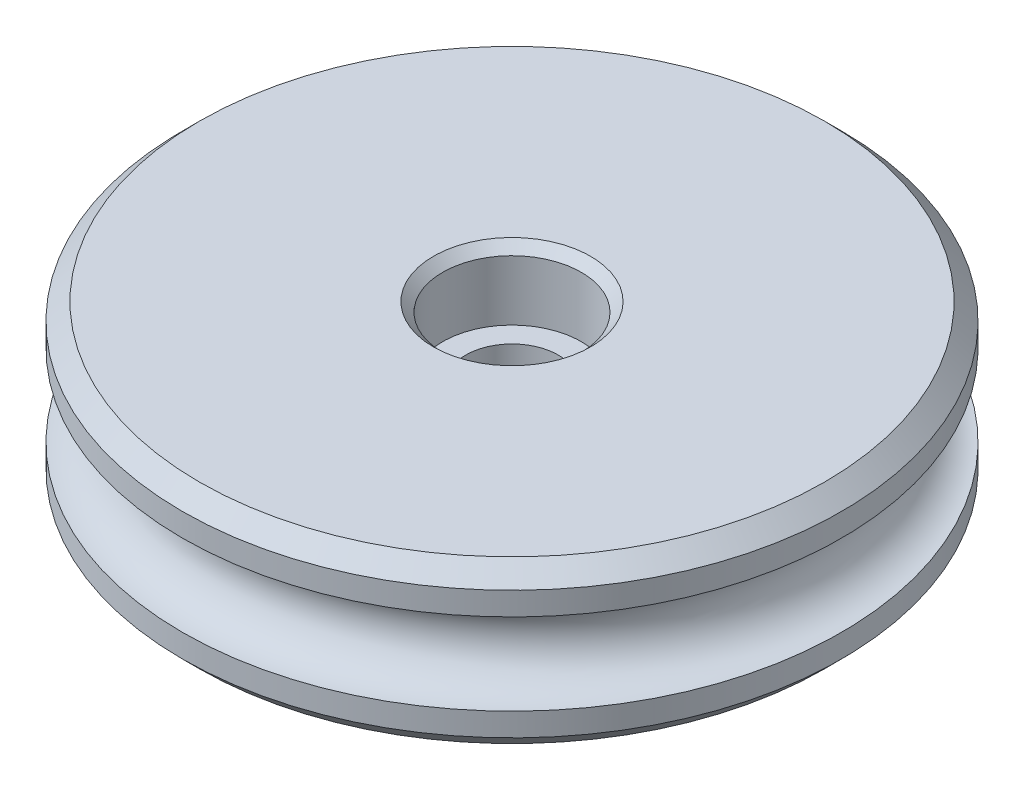
ISO-10303-21;
HEADER;
FILE_DESCRIPTION(('STEP AP214'),'2;1');
FILE_NAME('part.step','',(''),(''),'','','');
FILE_SCHEMA(('AUTOMOTIVE_DESIGN { 1 0 10303 214 1 1 1 1 }'));
ENDSEC;
DATA;
#1=APPLICATION_CONTEXT('core data for automotive mechanical design processes');
#2=APPLICATION_PROTOCOL_DEFINITION('international standard','automotive_design',2000,#1);
#3=PRODUCT_CONTEXT('',#1,'mechanical');
#4=PRODUCT('Part','Part','',(#3));
#5=PRODUCT_RELATED_PRODUCT_CATEGORY('part','',(#4));
#6=PRODUCT_DEFINITION_FORMATION('','',#4);
#7=PRODUCT_DEFINITION_CONTEXT('part definition',#1,'design');
#8=PRODUCT_DEFINITION('design','',#6,#7);
#9=PRODUCT_DEFINITION_SHAPE('','',#8);
#10=(LENGTH_UNIT() NAMED_UNIT(*) SI_UNIT(.MILLI.,.METRE.));
#11=(NAMED_UNIT(*) PLANE_ANGLE_UNIT() SI_UNIT($,.RADIAN.));
#12=(NAMED_UNIT(*) SI_UNIT($,.STERADIAN.) SOLID_ANGLE_UNIT());
#13=UNCERTAINTY_MEASURE_WITH_UNIT(LENGTH_MEASURE(1.E-05),#10,'distance_accuracy_value','');
#14=(GEOMETRIC_REPRESENTATION_CONTEXT(3) GLOBAL_UNCERTAINTY_ASSIGNED_CONTEXT((#13)) GLOBAL_UNIT_ASSIGNED_CONTEXT((#10,
#11,#12)) REPRESENTATION_CONTEXT('',''));
#15=CARTESIAN_POINT('',(0.,0.,0.));
#16=DIRECTION('',(0.,0.,1.));
#17=DIRECTION('',(1.,0.,0.));
#18=AXIS2_PLACEMENT_3D('',#15,#16,#17);
#19=CARTESIAN_POINT('',(0.,19.0174021430808,0.));
#20=DIRECTION('',(0.,1.,0.));
#21=DIRECTION('',(0.,0.,1.));
#22=AXIS2_PLACEMENT_3D('',#19,#20,#21);
#23=CYLINDRICAL_SURFACE('',#22,3.);
#24=CARTESIAN_POINT('',(0.,3.1,0.));
#25=DIRECTION('',(0.,1.,0.));
#26=DIRECTION('',(0.,0.,1.));
#27=AXIS2_PLACEMENT_3D('',#24,#25,#26);
#28=CIRCLE('',#27,3.);
#29=CARTESIAN_POINT('',(0.,3.1,3.));
#30=VERTEX_POINT('',#29);
#31=EDGE_CURVE('E61',#30,#30,#28,.T.);
#32=ORIENTED_EDGE('',*,*,#31,.T.);
#33=EDGE_LOOP('',(#32));
#34=FACE_BOUND('',#33,.T.);
#35=CARTESIAN_POINT('',(0.,0.5,0.));
#36=DIRECTION('',(0.,1.,0.));
#37=DIRECTION('',(0.,0.,1.));
#38=AXIS2_PLACEMENT_3D('',#35,#36,#37);
#39=CIRCLE('',#38,3.);
#40=CARTESIAN_POINT('',(0.,0.5,3.));
#41=VERTEX_POINT('',#40);
#42=EDGE_CURVE('E83',#41,#41,#39,.T.);
#43=ORIENTED_EDGE('',*,*,#42,.F.);
#44=EDGE_LOOP('',(#43));
#45=FACE_BOUND('',#44,.T.);
#46=ADVANCED_FACE('F42',(#34,#45),#23,.F.);
#47=CARTESIAN_POINT('',(0.,3.5,3.));
#48=DIRECTION('',(0.,1.,0.));
#49=DIRECTION('',(0.,0.,1.));
#50=AXIS2_PLACEMENT_3D('',#47,#48,#49);
#51=PLANE('',#50);
#52=CARTESIAN_POINT('',(0.,3.5,0.));
#53=DIRECTION('',(0.,1.,0.));
#54=DIRECTION('',(0.,0.,1.));
#55=AXIS2_PLACEMENT_3D('',#52,#53,#54);
#56=CIRCLE('',#55,3.4);
#57=CARTESIAN_POINT('',(0.,3.5,3.4));
#58=VERTEX_POINT('',#57);
#59=EDGE_CURVE('E56',#58,#58,#56,.F.);
#60=ORIENTED_EDGE('',*,*,#59,.T.);
#61=EDGE_LOOP('',(#60));
#62=FACE_BOUND('',#61,.T.);
#63=CARTESIAN_POINT('',(0.,3.5,0.));
#64=DIRECTION('',(0.,1.,0.));
#65=DIRECTION('',(0.,0.,1.));
#66=AXIS2_PLACEMENT_3D('',#63,#64,#65);
#67=CIRCLE('',#66,13.5274);
#68=CARTESIAN_POINT('',(0.,3.5,13.5274));
#69=VERTEX_POINT('',#68);
#70=EDGE_CURVE('E67',#69,#69,#67,.T.);
#71=ORIENTED_EDGE('',*,*,#70,.T.);
#72=EDGE_LOOP('',(#71));
#73=FACE_BOUND('',#72,.T.);
#74=ADVANCED_FACE('F134',(#62,#73),#51,.T.);
#75=CARTESIAN_POINT('',(0.,3.5,0.));
#76=DIRECTION('',(0.,-1.,0.));
#77=DIRECTION('',(0.,0.,-1.));
#78=AXIS2_PLACEMENT_3D('',#75,#76,#77);
#79=CONICAL_SURFACE('',#78,13.5274,0.785398163397453);
#80=CARTESIAN_POINT('',(0.,2.7653,0.));
#81=DIRECTION('',(0.,1.,0.));
#82=DIRECTION('',(0.,0.,1.));
#83=AXIS2_PLACEMENT_3D('',#80,#81,#82);
#84=CIRCLE('',#83,14.2621);
#85=CARTESIAN_POINT('',(0.,2.7653,14.2621));
#86=VERTEX_POINT('',#85);
#87=EDGE_CURVE('E71',#86,#86,#84,.T.);
#88=ORIENTED_EDGE('',*,*,#87,.T.);
#89=EDGE_LOOP('',(#88));
#90=FACE_BOUND('',#89,.T.);
#91=ORIENTED_EDGE('',*,*,#70,.F.);
#92=EDGE_LOOP('',(#91));
#93=FACE_BOUND('',#92,.T.);
#94=ADVANCED_FACE('F141',(#90,#93),#79,.T.);
#95=CARTESIAN_POINT('',(0.,19.0174021430808,0.));
#96=DIRECTION('',(0.,1.,0.));
#97=DIRECTION('',(0.,0.,1.));
#98=AXIS2_PLACEMENT_3D('',#95,#96,#97);
#99=CYLINDRICAL_SURFACE('',#98,14.2621);
#100=CARTESIAN_POINT('',(0.,1.7653,0.));
#101=DIRECTION('',(0.,1.,0.));
#102=DIRECTION('',(0.,0.,1.));
#103=AXIS2_PLACEMENT_3D('',#100,#101,#102);
#104=CIRCLE('',#103,14.2621);
#105=CARTESIAN_POINT('',(0.,1.7653,14.2621));
#106=VERTEX_POINT('',#105);
#107=EDGE_CURVE('E75',#106,#106,#104,.T.);
#108=ORIENTED_EDGE('',*,*,#107,.T.);
#109=EDGE_LOOP('',(#108));
#110=FACE_BOUND('',#109,.T.);
#111=ORIENTED_EDGE('',*,*,#87,.F.);
#112=EDGE_LOOP('',(#111));
#113=FACE_BOUND('',#112,.T.);
#114=ADVANCED_FACE('F130',(#110,#113),#99,.T.);
#115=CARTESIAN_POINT('',(0.,0.,0.));
#116=DIRECTION('',(0.,1.,0.));
#117=DIRECTION('',(0.,0.,1.));
#118=AXIS2_PLACEMENT_3D('',#115,#116,#117);
#119=TOROIDAL_SURFACE('',#118,14.2621,1.7653);
#120=ORIENTED_EDGE('',*,*,#107,.F.);
#121=EDGE_LOOP('',(#120));
#122=FACE_BOUND('',#121,.T.);
#123=CARTESIAN_POINT('',(0.,-1.7653,0.));
#124=DIRECTION('',(0.,1.,0.));
#125=DIRECTION('',(0.,0.,1.));
#126=AXIS2_PLACEMENT_3D('',#123,#124,#125);
#127=CIRCLE('',#126,14.2621);
#128=CARTESIAN_POINT('',(0.,-1.7653,14.2621));
#129=VERTEX_POINT('',#128);
#130=EDGE_CURVE('E95',#129,#129,#127,.T.);
#131=ORIENTED_EDGE('',*,*,#130,.T.);
#132=EDGE_LOOP('',(#131));
#133=FACE_BOUND('',#132,.T.);
#134=ADVANCED_FACE('F121',(#122,#133),#119,.F.);
#135=CARTESIAN_POINT('',(0.,19.0174021430808,0.));
#136=DIRECTION('',(0.,1.,0.));
#137=DIRECTION('',(0.,0.,1.));
#138=AXIS2_PLACEMENT_3D('',#135,#136,#137);
#139=CYLINDRICAL_SURFACE('',#138,2.);
#140=CARTESIAN_POINT('',(0.,0.5,0.));
#141=DIRECTION('',(0.,1.,0.));
#142=DIRECTION('',(0.,0.,1.));
#143=AXIS2_PLACEMENT_3D('',#140,#141,#142);
#144=CIRCLE('',#143,2.);
#145=CARTESIAN_POINT('',(0.,0.5,2.));
#146=VERTEX_POINT('',#145);
#147=EDGE_CURVE('E79',#146,#146,#144,.T.);
#148=ORIENTED_EDGE('',*,*,#147,.T.);
#149=EDGE_LOOP('',(#148));
#150=FACE_BOUND('',#149,.T.);
#151=CARTESIAN_POINT('',(0.,-0.5,0.));
#152=DIRECTION('',(0.,1.,0.));
#153=DIRECTION('',(0.,0.,1.));
#154=AXIS2_PLACEMENT_3D('',#151,#152,#153);
#155=CIRCLE('',#154,2.);
#156=CARTESIAN_POINT('',(0.,-0.5,2.));
#157=VERTEX_POINT('',#156);
#158=EDGE_CURVE('E99',#157,#157,#155,.T.);
#159=ORIENTED_EDGE('',*,*,#158,.F.);
#160=EDGE_LOOP('',(#159));
#161=FACE_BOUND('',#160,.T.);
#162=ADVANCED_FACE('F118',(#150,#161),#139,.F.);
#163=CARTESIAN_POINT('',(0.,0.499999999999999,2.));
#164=DIRECTION('',(0.,1.,0.));
#165=DIRECTION('',(0.,0.,1.));
#166=AXIS2_PLACEMENT_3D('',#163,#164,#165);
#167=PLANE('',#166);
#168=ORIENTED_EDGE('',*,*,#42,.T.);
#169=EDGE_LOOP('',(#168));
#170=FACE_BOUND('',#169,.T.);
#171=ORIENTED_EDGE('',*,*,#147,.F.);
#172=EDGE_LOOP('',(#171));
#173=FACE_BOUND('',#172,.T.);
#174=ADVANCED_FACE('F120',(#170,#173),#167,.T.);
#175=CARTESIAN_POINT('',(0.,-19.0174021430808,0.));
#176=DIRECTION('',(0.,-1.,0.));
#177=DIRECTION('',(0.,0.,1.));
#178=AXIS2_PLACEMENT_3D('',#175,#176,#177);
#179=CYLINDRICAL_SURFACE('',#178,3.);
#180=CARTESIAN_POINT('',(0.,-3.1,0.));
#181=DIRECTION('',(0.,-1.,0.));
#182=DIRECTION('',(0.,0.,-1.));
#183=AXIS2_PLACEMENT_3D('',#180,#181,#182);
#184=CIRCLE('',#183,3.);
#185=CARTESIAN_POINT('',(0.,-3.1,-3.));
#186=VERTEX_POINT('',#185);
#187=EDGE_CURVE('E10',#186,#186,#184,.T.);
#188=ORIENTED_EDGE('',*,*,#187,.T.);
#189=EDGE_LOOP('',(#188));
#190=FACE_BOUND('',#189,.T.);
#191=CARTESIAN_POINT('',(0.,-0.5,0.));
#192=DIRECTION('',(0.,1.,0.));
#193=DIRECTION('',(0.,0.,1.));
#194=AXIS2_PLACEMENT_3D('',#191,#192,#193);
#195=CIRCLE('',#194,3.);
#196=CARTESIAN_POINT('',(0.,-0.5,3.));
#197=VERTEX_POINT('',#196);
#198=EDGE_CURVE('E103',#197,#197,#195,.T.);
#199=ORIENTED_EDGE('',*,*,#198,.T.);
#200=EDGE_LOOP('',(#199));
#201=FACE_BOUND('',#200,.T.);
#202=ADVANCED_FACE('F108',(#190,#201),#179,.F.);
#203=CARTESIAN_POINT('',(0.,-3.5,3.));
#204=DIRECTION('',(0.,-1.,0.));
#205=DIRECTION('',(0.,0.,1.));
#206=AXIS2_PLACEMENT_3D('',#203,#204,#205);
#207=PLANE('',#206);
#208=CARTESIAN_POINT('',(0.,-3.5,0.));
#209=DIRECTION('',(0.,-1.,0.));
#210=DIRECTION('',(0.,0.,-1.));
#211=AXIS2_PLACEMENT_3D('',#208,#209,#210);
#212=CIRCLE('',#211,3.4);
#213=CARTESIAN_POINT('',(0.,-3.5,-3.4));
#214=VERTEX_POINT('',#213);
#215=EDGE_CURVE('E51',#214,#214,#212,.F.);
#216=ORIENTED_EDGE('',*,*,#215,.T.);
#217=EDGE_LOOP('',(#216));
#218=FACE_BOUND('',#217,.T.);
#219=CARTESIAN_POINT('',(0.,-3.5,0.));
#220=DIRECTION('',(0.,1.,0.));
#221=DIRECTION('',(0.,0.,1.));
#222=AXIS2_PLACEMENT_3D('',#219,#220,#221);
#223=CIRCLE('',#222,13.5274);
#224=CARTESIAN_POINT('',(0.,-3.5,13.5274));
#225=VERTEX_POINT('',#224);
#226=EDGE_CURVE('E87',#225,#225,#223,.T.);
#227=ORIENTED_EDGE('',*,*,#226,.F.);
#228=EDGE_LOOP('',(#227));
#229=FACE_BOUND('',#228,.T.);
#230=ADVANCED_FACE('F185',(#218,#229),#207,.T.);
#231=CARTESIAN_POINT('',(0.,-3.5,0.));
#232=DIRECTION('',(0.,1.,0.));
#233=DIRECTION('',(0.,0.,-1.));
#234=AXIS2_PLACEMENT_3D('',#231,#232,#233);
#235=CONICAL_SURFACE('',#234,13.5274,0.785398163397453);
#236=CARTESIAN_POINT('',(0.,-2.7653,0.));
#237=DIRECTION('',(0.,1.,0.));
#238=DIRECTION('',(0.,0.,1.));
#239=AXIS2_PLACEMENT_3D('',#236,#237,#238);
#240=CIRCLE('',#239,14.2621);
#241=CARTESIAN_POINT('',(0.,-2.7653,14.2621));
#242=VERTEX_POINT('',#241);
#243=EDGE_CURVE('E91',#242,#242,#240,.T.);
#244=ORIENTED_EDGE('',*,*,#243,.F.);
#245=EDGE_LOOP('',(#244));
#246=FACE_BOUND('',#245,.T.);
#247=ORIENTED_EDGE('',*,*,#226,.T.);
#248=EDGE_LOOP('',(#247));
#249=FACE_BOUND('',#248,.T.);
#250=ADVANCED_FACE('F179',(#246,#249),#235,.T.);
#251=CARTESIAN_POINT('',(0.,-19.0174021430808,0.));
#252=DIRECTION('',(0.,-1.,0.));
#253=DIRECTION('',(0.,0.,1.));
#254=AXIS2_PLACEMENT_3D('',#251,#252,#253);
#255=CYLINDRICAL_SURFACE('',#254,14.2621);
#256=ORIENTED_EDGE('',*,*,#130,.F.);
#257=EDGE_LOOP('',(#256));
#258=FACE_BOUND('',#257,.T.);
#259=ORIENTED_EDGE('',*,*,#243,.T.);
#260=EDGE_LOOP('',(#259));
#261=FACE_BOUND('',#260,.T.);
#262=ADVANCED_FACE('F114',(#258,#261),#255,.T.);
#263=CARTESIAN_POINT('',(0.,-0.499999999999999,2.));
#264=DIRECTION('',(0.,-1.,0.));
#265=DIRECTION('',(0.,0.,1.));
#266=AXIS2_PLACEMENT_3D('',#263,#264,#265);
#267=PLANE('',#266);
#268=ORIENTED_EDGE('',*,*,#198,.F.);
#269=EDGE_LOOP('',(#268));
#270=FACE_BOUND('',#269,.T.);
#271=ORIENTED_EDGE('',*,*,#158,.T.);
#272=EDGE_LOOP('',(#271));
#273=FACE_BOUND('',#272,.T.);
#274=ADVANCED_FACE('F110',(#270,#273),#267,.T.);
#275=CARTESIAN_POINT('',(0.,3.1,0.));
#276=DIRECTION('',(0.,1.,0.));
#277=DIRECTION('',(0.,0.,1.));
#278=AXIS2_PLACEMENT_3D('',#275,#276,#277);
#279=CONICAL_SURFACE('',#278,3.,0.785398163397445);
#280=ORIENTED_EDGE('',*,*,#59,.F.);
#281=EDGE_LOOP('',(#280));
#282=FACE_BOUND('',#281,.T.);
#283=ORIENTED_EDGE('',*,*,#31,.F.);
#284=EDGE_LOOP('',(#283));
#285=FACE_BOUND('',#284,.T.);
#286=ADVANCED_FACE('F113',(#282,#285),#279,.F.);
#287=CARTESIAN_POINT('',(0.,-3.5,0.));
#288=DIRECTION('',(0.,-1.,0.));
#289=DIRECTION('',(0.,0.,-1.));
#290=AXIS2_PLACEMENT_3D('',#287,#288,#289);
#291=CONICAL_SURFACE('',#290,3.4,0.785398163397445);
#292=ORIENTED_EDGE('',*,*,#187,.F.);
#293=EDGE_LOOP('',(#292));
#294=FACE_BOUND('',#293,.T.);
#295=ORIENTED_EDGE('',*,*,#215,.F.);
#296=EDGE_LOOP('',(#295));
#297=FACE_BOUND('',#296,.T.);
#298=ADVANCED_FACE('F45',(#294,#297),#291,.F.);
#299=CLOSED_SHELL('',(#46,#74,#94,#114,#134,#162,#174,#202,#230,#250,#262,#274,#286,#298));
#300=MANIFOLD_SOLID_BREP('B2',#299);
#301=ADVANCED_BREP_SHAPE_REPRESENTATION('',(#18,#300),#14);
#302=SHAPE_DEFINITION_REPRESENTATION(#9,#301);
ENDSEC;
END-ISO-10303-21;
